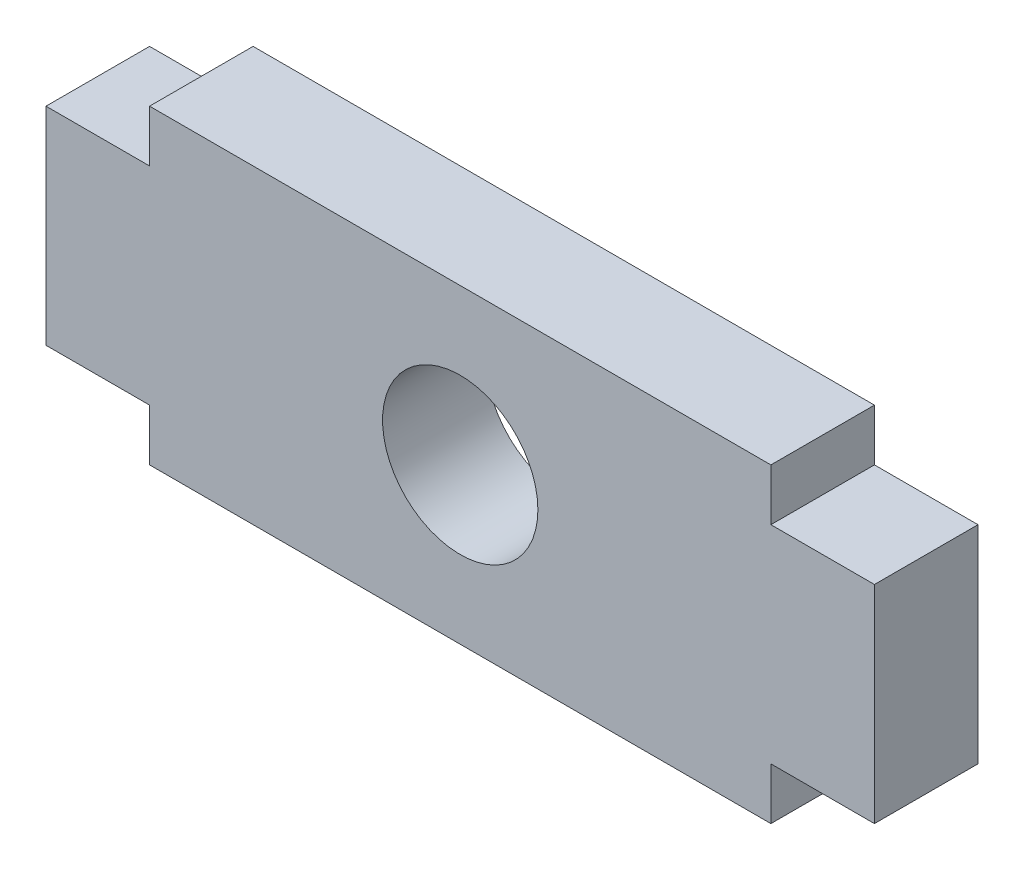
ISO-10303-21;
HEADER;
FILE_DESCRIPTION(('STEP AP214'),'2;1');
FILE_NAME('part.step','',(''),(''),'','','');
FILE_SCHEMA(('AUTOMOTIVE_DESIGN { 1 0 10303 214 1 1 1 1 }'));
ENDSEC;
DATA;
#1=APPLICATION_CONTEXT('core data for automotive mechanical design processes');
#2=APPLICATION_PROTOCOL_DEFINITION('international standard','automotive_design',2000,#1);
#3=PRODUCT_CONTEXT('',#1,'mechanical');
#4=PRODUCT('Part','Part','',(#3));
#5=PRODUCT_RELATED_PRODUCT_CATEGORY('part','',(#4));
#6=PRODUCT_DEFINITION_FORMATION('','',#4);
#7=PRODUCT_DEFINITION_CONTEXT('part definition',#1,'design');
#8=PRODUCT_DEFINITION('design','',#6,#7);
#9=PRODUCT_DEFINITION_SHAPE('','',#8);
#10=(LENGTH_UNIT() NAMED_UNIT(*) SI_UNIT(.MILLI.,.METRE.));
#11=(NAMED_UNIT(*) PLANE_ANGLE_UNIT() SI_UNIT($,.RADIAN.));
#12=(NAMED_UNIT(*) SI_UNIT($,.STERADIAN.) SOLID_ANGLE_UNIT());
#13=UNCERTAINTY_MEASURE_WITH_UNIT(LENGTH_MEASURE(1.E-05),#10,'distance_accuracy_value','');
#14=(GEOMETRIC_REPRESENTATION_CONTEXT(3) GLOBAL_UNCERTAINTY_ASSIGNED_CONTEXT((#13)) GLOBAL_UNIT_ASSIGNED_CONTEXT((#10,
#11,#12)) REPRESENTATION_CONTEXT('',''));
#15=CARTESIAN_POINT('',(0.,0.,0.));
#16=DIRECTION('',(0.,0.,1.));
#17=DIRECTION('',(1.,0.,0.));
#18=AXIS2_PLACEMENT_3D('',#15,#16,#17);
#19=CARTESIAN_POINT('',(0.,3.175,3.175));
#20=DIRECTION('',(0.,-1.,0.));
#21=DIRECTION('',(1.,0.,0.));
#22=AXIS2_PLACEMENT_3D('',#19,#20,#21);
#23=PLANE('',#22);
#24=DIRECTION('',(-1.,0.,0.));
#25=VECTOR('',#24,1.);
#26=CARTESIAN_POINT('',(0.,3.175,0.));
#27=LINE('',#26,#25);
#28=CARTESIAN_POINT('',(-9.525,3.175,0.));
#29=VERTEX_POINT('',#28);
#30=CARTESIAN_POINT('',(-12.7,3.175,0.));
#31=VERTEX_POINT('',#30);
#32=EDGE_CURVE('E162',#29,#31,#27,.T.);
#33=ORIENTED_EDGE('',*,*,#32,.T.);
#34=DIRECTION('',(0.,0.,-1.));
#35=VECTOR('',#34,1.);
#36=CARTESIAN_POINT('',(-12.7,3.175,3.175));
#37=LINE('',#36,#35);
#38=CARTESIAN_POINT('',(-12.7,3.175,3.175));
#39=VERTEX_POINT('',#38);
#40=EDGE_CURVE('E11',#39,#31,#37,.T.);
#41=ORIENTED_EDGE('',*,*,#40,.F.);
#42=DIRECTION('',(-1.,0.,0.));
#43=VECTOR('',#42,1.);
#44=CARTESIAN_POINT('',(0.,3.175,3.175));
#45=LINE('',#44,#43);
#46=CARTESIAN_POINT('',(-9.525,3.175,3.175));
#47=VERTEX_POINT('',#46);
#48=EDGE_CURVE('E192',#47,#39,#45,.T.);
#49=ORIENTED_EDGE('',*,*,#48,.F.);
#50=DIRECTION('',(0.,0.,-1.));
#51=VECTOR('',#50,1.);
#52=CARTESIAN_POINT('',(-9.525,3.175,3.175));
#53=LINE('',#52,#51);
#54=EDGE_CURVE('E51',#47,#29,#53,.T.);
#55=ORIENTED_EDGE('',*,*,#54,.T.);
#56=EDGE_LOOP('',(#33,#41,#49,#55));
#57=FACE_BOUND('',#56,.T.);
#58=ADVANCED_FACE('F35',(#57),#23,.F.);
#59=CARTESIAN_POINT('',(-12.7,0.,3.175));
#60=DIRECTION('',(1.,0.,0.));
#61=DIRECTION('',(0.,0.,-1.));
#62=AXIS2_PLACEMENT_3D('',#59,#60,#61);
#63=PLANE('',#62);
#64=DIRECTION('',(0.,-1.,0.));
#65=VECTOR('',#64,1.);
#66=CARTESIAN_POINT('',(-12.7,0.,0.));
#67=LINE('',#66,#65);
#68=CARTESIAN_POINT('',(-12.7,-3.175,0.));
#69=VERTEX_POINT('',#68);
#70=EDGE_CURVE('E164',#31,#69,#67,.T.);
#71=ORIENTED_EDGE('',*,*,#70,.T.);
#72=DIRECTION('',(0.,0.,-1.));
#73=VECTOR('',#72,1.);
#74=CARTESIAN_POINT('',(-12.7,-3.175,3.175));
#75=LINE('',#74,#73);
#76=CARTESIAN_POINT('',(-12.7,-3.175,3.175));
#77=VERTEX_POINT('',#76);
#78=EDGE_CURVE('E43',#77,#69,#75,.T.);
#79=ORIENTED_EDGE('',*,*,#78,.F.);
#80=DIRECTION('',(0.,-1.,0.));
#81=VECTOR('',#80,1.);
#82=CARTESIAN_POINT('',(-12.7,0.,3.175));
#83=LINE('',#82,#81);
#84=EDGE_CURVE('E102',#39,#77,#83,.T.);
#85=ORIENTED_EDGE('',*,*,#84,.F.);
#86=ORIENTED_EDGE('',*,*,#40,.T.);
#87=EDGE_LOOP('',(#71,#79,#85,#86));
#88=FACE_BOUND('',#87,.T.);
#89=ADVANCED_FACE('F215',(#88),#63,.F.);
#90=CARTESIAN_POINT('',(0.,-3.175,3.175));
#91=DIRECTION('',(0.,-1.,0.));
#92=DIRECTION('',(1.,0.,0.));
#93=AXIS2_PLACEMENT_3D('',#90,#91,#92);
#94=PLANE('',#93);
#95=DIRECTION('',(-1.,0.,0.));
#96=VECTOR('',#95,1.);
#97=CARTESIAN_POINT('',(0.,-3.175,0.));
#98=LINE('',#97,#96);
#99=CARTESIAN_POINT('',(-9.525,-3.175,0.));
#100=VERTEX_POINT('',#99);
#101=EDGE_CURVE('E167',#100,#69,#98,.T.);
#102=ORIENTED_EDGE('',*,*,#101,.F.);
#103=DIRECTION('',(0.,0.,-1.));
#104=VECTOR('',#103,1.);
#105=CARTESIAN_POINT('',(-9.525,-3.175,3.175));
#106=LINE('',#105,#104);
#107=CARTESIAN_POINT('',(-9.525,-3.175,3.175));
#108=VERTEX_POINT('',#107);
#109=EDGE_CURVE('E208',#108,#100,#106,.T.);
#110=ORIENTED_EDGE('',*,*,#109,.F.);
#111=DIRECTION('',(-1.,0.,0.));
#112=VECTOR('',#111,1.);
#113=CARTESIAN_POINT('',(0.,-3.175,3.175));
#114=LINE('',#113,#112);
#115=EDGE_CURVE('E214',#108,#77,#114,.T.);
#116=ORIENTED_EDGE('',*,*,#115,.T.);
#117=ORIENTED_EDGE('',*,*,#78,.T.);
#118=EDGE_LOOP('',(#102,#110,#116,#117));
#119=FACE_BOUND('',#118,.T.);
#120=ADVANCED_FACE('F212',(#119),#94,.T.);
#121=CARTESIAN_POINT('',(-9.525,0.,3.175));
#122=DIRECTION('',(-1.,0.,0.));
#123=DIRECTION('',(0.,0.,1.));
#124=AXIS2_PLACEMENT_3D('',#121,#122,#123);
#125=PLANE('',#124);
#126=DIRECTION('',(0.,1.,0.));
#127=VECTOR('',#126,1.);
#128=CARTESIAN_POINT('',(-9.525,0.,0.));
#129=LINE('',#128,#127);
#130=CARTESIAN_POINT('',(-9.525,-4.7625,0.));
#131=VERTEX_POINT('',#130);
#132=EDGE_CURVE('E170',#131,#100,#129,.T.);
#133=ORIENTED_EDGE('',*,*,#132,.F.);
#134=DIRECTION('',(0.,0.,-1.));
#135=VECTOR('',#134,1.);
#136=CARTESIAN_POINT('',(-9.525,-4.7625,3.175));
#137=LINE('',#136,#135);
#138=CARTESIAN_POINT('',(-9.525,-4.7625,3.175));
#139=VERTEX_POINT('',#138);
#140=EDGE_CURVE('E206',#139,#131,#137,.T.);
#141=ORIENTED_EDGE('',*,*,#140,.F.);
#142=DIRECTION('',(0.,1.,0.));
#143=VECTOR('',#142,1.);
#144=CARTESIAN_POINT('',(-9.525,0.,3.175));
#145=LINE('',#144,#143);
#146=EDGE_CURVE('E156',#139,#108,#145,.T.);
#147=ORIENTED_EDGE('',*,*,#146,.T.);
#148=ORIENTED_EDGE('',*,*,#109,.T.);
#149=EDGE_LOOP('',(#133,#141,#147,#148));
#150=FACE_BOUND('',#149,.T.);
#151=ADVANCED_FACE('F224',(#150),#125,.T.);
#152=CARTESIAN_POINT('',(0.,-4.7625,3.175));
#153=DIRECTION('',(0.,-1.,0.));
#154=DIRECTION('',(1.,0.,0.));
#155=AXIS2_PLACEMENT_3D('',#152,#153,#154);
#156=PLANE('',#155);
#157=DIRECTION('',(-1.,0.,0.));
#158=VECTOR('',#157,1.);
#159=CARTESIAN_POINT('',(0.,-4.7625,0.));
#160=LINE('',#159,#158);
#161=CARTESIAN_POINT('',(9.525,-4.7625,0.));
#162=VERTEX_POINT('',#161);
#163=EDGE_CURVE('E173',#162,#131,#160,.T.);
#164=ORIENTED_EDGE('',*,*,#163,.F.);
#165=DIRECTION('',(0.,0.,-1.));
#166=VECTOR('',#165,1.);
#167=CARTESIAN_POINT('',(9.525,-4.7625,3.175));
#168=LINE('',#167,#166);
#169=CARTESIAN_POINT('',(9.525,-4.7625,3.175));
#170=VERTEX_POINT('',#169);
#171=EDGE_CURVE('E204',#170,#162,#168,.T.);
#172=ORIENTED_EDGE('',*,*,#171,.F.);
#173=DIRECTION('',(-1.,0.,0.));
#174=VECTOR('',#173,1.);
#175=CARTESIAN_POINT('',(0.,-4.7625,3.175));
#176=LINE('',#175,#174);
#177=EDGE_CURVE('E230',#170,#139,#176,.T.);
#178=ORIENTED_EDGE('',*,*,#177,.T.);
#179=ORIENTED_EDGE('',*,*,#140,.T.);
#180=EDGE_LOOP('',(#164,#172,#178,#179));
#181=FACE_BOUND('',#180,.T.);
#182=ADVANCED_FACE('F256',(#181),#156,.T.);
#183=CARTESIAN_POINT('',(9.525,0.,3.175));
#184=DIRECTION('',(-1.,0.,0.));
#185=DIRECTION('',(0.,0.,1.));
#186=AXIS2_PLACEMENT_3D('',#183,#184,#185);
#187=PLANE('',#186);
#188=DIRECTION('',(0.,1.,0.));
#189=VECTOR('',#188,1.);
#190=CARTESIAN_POINT('',(9.525,0.,0.));
#191=LINE('',#190,#189);
#192=CARTESIAN_POINT('',(9.525,-3.175,0.));
#193=VERTEX_POINT('',#192);
#194=EDGE_CURVE('E177',#162,#193,#191,.T.);
#195=ORIENTED_EDGE('',*,*,#194,.T.);
#196=DIRECTION('',(0.,0.,-1.));
#197=VECTOR('',#196,1.);
#198=CARTESIAN_POINT('',(9.525,-3.175,3.175));
#199=LINE('',#198,#197);
#200=CARTESIAN_POINT('',(9.525,-3.175,3.175));
#201=VERTEX_POINT('',#200);
#202=EDGE_CURVE('E201',#201,#193,#199,.T.);
#203=ORIENTED_EDGE('',*,*,#202,.F.);
#204=DIRECTION('',(0.,1.,0.));
#205=VECTOR('',#204,1.);
#206=CARTESIAN_POINT('',(9.525,0.,3.175));
#207=LINE('',#206,#205);
#208=EDGE_CURVE('E141',#170,#201,#207,.T.);
#209=ORIENTED_EDGE('',*,*,#208,.F.);
#210=ORIENTED_EDGE('',*,*,#171,.T.);
#211=EDGE_LOOP('',(#195,#203,#209,#210));
#212=FACE_BOUND('',#211,.T.);
#213=ADVANCED_FACE('F268',(#212),#187,.F.);
#214=CARTESIAN_POINT('',(0.,-3.175,3.175));
#215=DIRECTION('',(0.,1.,0.));
#216=DIRECTION('',(0.,0.,1.));
#217=AXIS2_PLACEMENT_3D('',#214,#215,#216);
#218=PLANE('',#217);
#219=DIRECTION('',(1.,0.,0.));
#220=VECTOR('',#219,1.);
#221=CARTESIAN_POINT('',(0.,-3.175,0.));
#222=LINE('',#221,#220);
#223=CARTESIAN_POINT('',(12.7,-3.175,0.));
#224=VERTEX_POINT('',#223);
#225=EDGE_CURVE('E179',#193,#224,#222,.T.);
#226=ORIENTED_EDGE('',*,*,#225,.T.);
#227=DIRECTION('',(0.,0.,-1.));
#228=VECTOR('',#227,1.);
#229=CARTESIAN_POINT('',(12.7,-3.175,3.175));
#230=LINE('',#229,#228);
#231=CARTESIAN_POINT('',(12.7,-3.175,3.175));
#232=VERTEX_POINT('',#231);
#233=EDGE_CURVE('E198',#232,#224,#230,.T.);
#234=ORIENTED_EDGE('',*,*,#233,.F.);
#235=DIRECTION('',(1.,0.,0.));
#236=VECTOR('',#235,1.);
#237=CARTESIAN_POINT('',(0.,-3.175,3.175));
#238=LINE('',#237,#236);
#239=EDGE_CURVE('E235',#201,#232,#238,.T.);
#240=ORIENTED_EDGE('',*,*,#239,.F.);
#241=ORIENTED_EDGE('',*,*,#202,.T.);
#242=EDGE_LOOP('',(#226,#234,#240,#241));
#243=FACE_BOUND('',#242,.T.);
#244=ADVANCED_FACE('F270',(#243),#218,.F.);
#245=CARTESIAN_POINT('',(12.7,0.,3.175));
#246=DIRECTION('',(-1.,0.,0.));
#247=DIRECTION('',(0.,0.,1.));
#248=AXIS2_PLACEMENT_3D('',#245,#246,#247);
#249=PLANE('',#248);
#250=DIRECTION('',(0.,1.,0.));
#251=VECTOR('',#250,1.);
#252=CARTESIAN_POINT('',(12.7,0.,0.));
#253=LINE('',#252,#251);
#254=CARTESIAN_POINT('',(12.7,3.175,0.));
#255=VERTEX_POINT('',#254);
#256=EDGE_CURVE('E181',#224,#255,#253,.T.);
#257=ORIENTED_EDGE('',*,*,#256,.T.);
#258=DIRECTION('',(0.,0.,-1.));
#259=VECTOR('',#258,1.);
#260=CARTESIAN_POINT('',(12.7,3.175,3.175));
#261=LINE('',#260,#259);
#262=CARTESIAN_POINT('',(12.7,3.175,3.175));
#263=VERTEX_POINT('',#262);
#264=EDGE_CURVE('E196',#263,#255,#261,.T.);
#265=ORIENTED_EDGE('',*,*,#264,.F.);
#266=DIRECTION('',(0.,1.,0.));
#267=VECTOR('',#266,1.);
#268=CARTESIAN_POINT('',(12.7,0.,3.175));
#269=LINE('',#268,#267);
#270=EDGE_CURVE('E236',#232,#263,#269,.T.);
#271=ORIENTED_EDGE('',*,*,#270,.F.);
#272=ORIENTED_EDGE('',*,*,#233,.T.);
#273=EDGE_LOOP('',(#257,#265,#271,#272));
#274=FACE_BOUND('',#273,.T.);
#275=ADVANCED_FACE('F273',(#274),#249,.F.);
#276=CARTESIAN_POINT('',(0.,3.175,3.175));
#277=DIRECTION('',(0.,1.,0.));
#278=DIRECTION('',(0.,0.,1.));
#279=AXIS2_PLACEMENT_3D('',#276,#277,#278);
#280=PLANE('',#279);
#281=DIRECTION('',(1.,0.,0.));
#282=VECTOR('',#281,1.);
#283=CARTESIAN_POINT('',(0.,3.175,0.));
#284=LINE('',#283,#282);
#285=CARTESIAN_POINT('',(9.525,3.175,0.));
#286=VERTEX_POINT('',#285);
#287=EDGE_CURVE('E184',#286,#255,#284,.T.);
#288=ORIENTED_EDGE('',*,*,#287,.F.);
#289=DIRECTION('',(0.,0.,-1.));
#290=VECTOR('',#289,1.);
#291=CARTESIAN_POINT('',(9.525,3.175,3.175));
#292=LINE('',#291,#290);
#293=CARTESIAN_POINT('',(9.525,3.175,3.175));
#294=VERTEX_POINT('',#293);
#295=EDGE_CURVE('E149',#294,#286,#292,.T.);
#296=ORIENTED_EDGE('',*,*,#295,.F.);
#297=DIRECTION('',(1.,0.,0.));
#298=VECTOR('',#297,1.);
#299=CARTESIAN_POINT('',(0.,3.175,3.175));
#300=LINE('',#299,#298);
#301=EDGE_CURVE('E138',#294,#263,#300,.T.);
#302=ORIENTED_EDGE('',*,*,#301,.T.);
#303=ORIENTED_EDGE('',*,*,#264,.T.);
#304=EDGE_LOOP('',(#288,#296,#302,#303));
#305=FACE_BOUND('',#304,.T.);
#306=ADVANCED_FACE('F241',(#305),#280,.T.);
#307=CARTESIAN_POINT('',(9.525,4.7625,0.));
#308=VERTEX_POINT('',#307);
#309=EDGE_CURVE('E146',#286,#308,#191,.T.);
#310=ORIENTED_EDGE('',*,*,#309,.T.);
#311=DIRECTION('',(0.,0.,-1.));
#312=VECTOR('',#311,1.);
#313=CARTESIAN_POINT('',(9.525,4.7625,3.175));
#314=LINE('',#313,#312);
#315=CARTESIAN_POINT('',(9.525,4.7625,3.175));
#316=VERTEX_POINT('',#315);
#317=EDGE_CURVE('E143',#316,#308,#314,.T.);
#318=ORIENTED_EDGE('',*,*,#317,.F.);
#319=EDGE_CURVE('E130',#294,#316,#207,.T.);
#320=ORIENTED_EDGE('',*,*,#319,.F.);
#321=ORIENTED_EDGE('',*,*,#295,.T.);
#322=EDGE_LOOP('',(#310,#318,#320,#321));
#323=FACE_BOUND('',#322,.T.);
#324=ADVANCED_FACE('F144',(#323),#187,.F.);
#325=CARTESIAN_POINT('',(0.,4.7625,3.175));
#326=DIRECTION('',(0.,-1.,0.));
#327=DIRECTION('',(1.,0.,0.));
#328=AXIS2_PLACEMENT_3D('',#325,#326,#327);
#329=PLANE('',#328);
#330=DIRECTION('',(-1.,0.,0.));
#331=VECTOR('',#330,1.);
#332=CARTESIAN_POINT('',(0.,4.7625,0.));
#333=LINE('',#332,#331);
#334=CARTESIAN_POINT('',(-9.525,4.7625,0.));
#335=VERTEX_POINT('',#334);
#336=EDGE_CURVE('E187',#308,#335,#333,.T.);
#337=ORIENTED_EDGE('',*,*,#336,.T.);
#338=DIRECTION('',(0.,0.,-1.));
#339=VECTOR('',#338,1.);
#340=CARTESIAN_POINT('',(-9.525,4.7625,3.175));
#341=LINE('',#340,#339);
#342=CARTESIAN_POINT('',(-9.525,4.7625,3.175));
#343=VERTEX_POINT('',#342);
#344=EDGE_CURVE('E90',#343,#335,#341,.T.);
#345=ORIENTED_EDGE('',*,*,#344,.F.);
#346=DIRECTION('',(-1.,0.,0.));
#347=VECTOR('',#346,1.);
#348=CARTESIAN_POINT('',(0.,4.7625,3.175));
#349=LINE('',#348,#347);
#350=EDGE_CURVE('E136',#316,#343,#349,.T.);
#351=ORIENTED_EDGE('',*,*,#350,.F.);
#352=ORIENTED_EDGE('',*,*,#317,.T.);
#353=EDGE_LOOP('',(#337,#345,#351,#352));
#354=FACE_BOUND('',#353,.T.);
#355=ADVANCED_FACE('F151',(#354),#329,.F.);
#356=EDGE_CURVE('E174',#29,#335,#129,.T.);
#357=ORIENTED_EDGE('',*,*,#356,.F.);
#358=ORIENTED_EDGE('',*,*,#54,.F.);
#359=EDGE_CURVE('E152',#47,#343,#145,.T.);
#360=ORIENTED_EDGE('',*,*,#359,.T.);
#361=ORIENTED_EDGE('',*,*,#344,.T.);
#362=EDGE_LOOP('',(#357,#358,#360,#361));
#363=FACE_BOUND('',#362,.T.);
#364=ADVANCED_FACE('F244',(#363),#125,.T.);
#365=CARTESIAN_POINT('',(0.,0.,3.175));
#366=DIRECTION('',(0.,0.,-1.));
#367=DIRECTION('',(-1.,0.,0.));
#368=AXIS2_PLACEMENT_3D('',#365,#366,#367);
#369=CYLINDRICAL_SURFACE('',#368,2.38125);
#370=CARTESIAN_POINT('',(0.,0.,3.175));
#371=DIRECTION('',(0.,0.,1.));
#372=DIRECTION('',(1.,0.,0.));
#373=AXIS2_PLACEMENT_3D('',#370,#371,#372);
#374=CIRCLE('',#373,2.38125);
#375=CARTESIAN_POINT('',(2.38125,0.,3.175));
#376=VERTEX_POINT('',#375);
#377=EDGE_CURVE('E154',#376,#376,#374,.T.);
#378=ORIENTED_EDGE('',*,*,#377,.T.);
#379=EDGE_LOOP('',(#378));
#380=FACE_BOUND('',#379,.T.);
#381=CARTESIAN_POINT('',(0.,0.,0.));
#382=DIRECTION('',(0.,0.,1.));
#383=DIRECTION('',(1.,0.,0.));
#384=AXIS2_PLACEMENT_3D('',#381,#382,#383);
#385=CIRCLE('',#384,2.38125);
#386=CARTESIAN_POINT('',(2.38125,0.,0.));
#387=VERTEX_POINT('',#386);
#388=EDGE_CURVE('E189',#387,#387,#385,.T.);
#389=ORIENTED_EDGE('',*,*,#388,.F.);
#390=EDGE_LOOP('',(#389));
#391=FACE_BOUND('',#390,.T.);
#392=ADVANCED_FACE('F246',(#380,#391),#369,.F.);
#393=CARTESIAN_POINT('',(0.,0.,3.175));
#394=DIRECTION('',(0.,0.,1.));
#395=DIRECTION('',(1.,0.,0.));
#396=AXIS2_PLACEMENT_3D('',#393,#394,#395);
#397=PLANE('',#396);
#398=ORIENTED_EDGE('',*,*,#48,.T.);
#399=ORIENTED_EDGE('',*,*,#84,.T.);
#400=ORIENTED_EDGE('',*,*,#115,.F.);
#401=ORIENTED_EDGE('',*,*,#146,.F.);
#402=ORIENTED_EDGE('',*,*,#177,.F.);
#403=ORIENTED_EDGE('',*,*,#208,.T.);
#404=ORIENTED_EDGE('',*,*,#239,.T.);
#405=ORIENTED_EDGE('',*,*,#270,.T.);
#406=ORIENTED_EDGE('',*,*,#301,.F.);
#407=ORIENTED_EDGE('',*,*,#319,.T.);
#408=ORIENTED_EDGE('',*,*,#350,.T.);
#409=ORIENTED_EDGE('',*,*,#359,.F.);
#410=EDGE_LOOP('',(#398,#399,#400,#401,#402,#403,#404,#405,#406,#407,#408,#409));
#411=FACE_BOUND('',#410,.T.);
#412=ORIENTED_EDGE('',*,*,#377,.F.);
#413=EDGE_LOOP('',(#412));
#414=FACE_BOUND('',#413,.T.);
#415=ADVANCED_FACE('F132',(#411,#414),#397,.T.);
#416=CARTESIAN_POINT('',(0.,0.,0.));
#417=DIRECTION('',(0.,0.,1.));
#418=DIRECTION('',(1.,0.,0.));
#419=AXIS2_PLACEMENT_3D('',#416,#417,#418);
#420=PLANE('',#419);
#421=ORIENTED_EDGE('',*,*,#32,.F.);
#422=ORIENTED_EDGE('',*,*,#356,.T.);
#423=ORIENTED_EDGE('',*,*,#336,.F.);
#424=ORIENTED_EDGE('',*,*,#309,.F.);
#425=ORIENTED_EDGE('',*,*,#287,.T.);
#426=ORIENTED_EDGE('',*,*,#256,.F.);
#427=ORIENTED_EDGE('',*,*,#225,.F.);
#428=ORIENTED_EDGE('',*,*,#194,.F.);
#429=ORIENTED_EDGE('',*,*,#163,.T.);
#430=ORIENTED_EDGE('',*,*,#132,.T.);
#431=ORIENTED_EDGE('',*,*,#101,.T.);
#432=ORIENTED_EDGE('',*,*,#70,.F.);
#433=EDGE_LOOP('',(#421,#422,#423,#424,#425,#426,#427,#428,#429,#430,#431,#432));
#434=FACE_BOUND('',#433,.T.);
#435=ORIENTED_EDGE('',*,*,#388,.T.);
#436=EDGE_LOOP('',(#435));
#437=FACE_BOUND('',#436,.T.);
#438=ADVANCED_FACE('F218',(#434,#437),#420,.F.);
#439=CLOSED_SHELL('',(#58,#89,#120,#151,#182,#213,#244,#275,#306,#324,#355,#364,#392,#415,#438));
#440=MANIFOLD_SOLID_BREP('B2',#439);
#441=ADVANCED_BREP_SHAPE_REPRESENTATION('',(#18,#440),#14);
#442=SHAPE_DEFINITION_REPRESENTATION(#9,#441);
ENDSEC;
END-ISO-10303-21;
